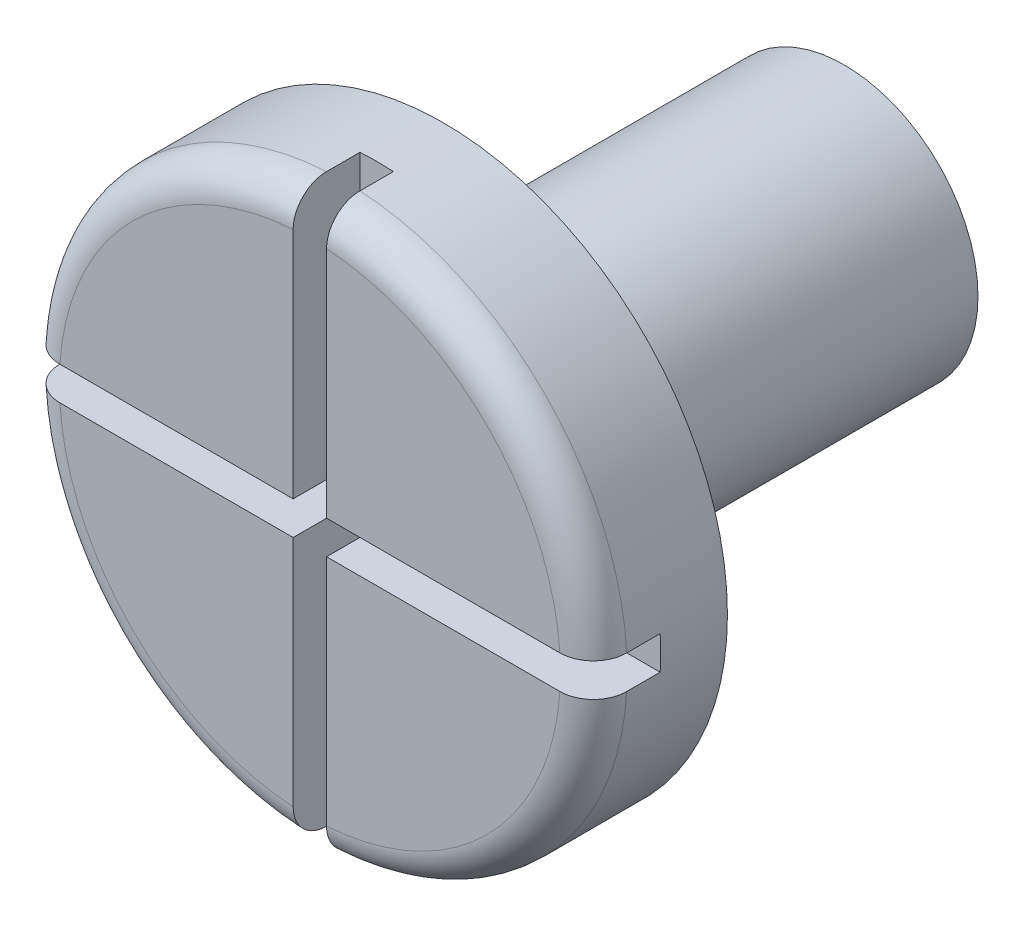
ISO-10303-21;
HEADER;
FILE_DESCRIPTION(('STEP AP214'),'2;1');
FILE_NAME('part.step','',(''),(''),'','','');
FILE_SCHEMA(('AUTOMOTIVE_DESIGN { 1 0 10303 214 1 1 1 1 }'));
ENDSEC;
DATA;
#1=APPLICATION_CONTEXT('core data for automotive mechanical design processes');
#2=APPLICATION_PROTOCOL_DEFINITION('international standard','automotive_design',2000,#1);
#3=PRODUCT_CONTEXT('',#1,'mechanical');
#4=PRODUCT('Part','Part','',(#3));
#5=PRODUCT_RELATED_PRODUCT_CATEGORY('part','',(#4));
#6=PRODUCT_DEFINITION_FORMATION('','',#4);
#7=PRODUCT_DEFINITION_CONTEXT('part definition',#1,'design');
#8=PRODUCT_DEFINITION('design','',#6,#7);
#9=PRODUCT_DEFINITION_SHAPE('','',#8);
#10=(LENGTH_UNIT() NAMED_UNIT(*) SI_UNIT(.MILLI.,.METRE.));
#11=(NAMED_UNIT(*) PLANE_ANGLE_UNIT() SI_UNIT($,.RADIAN.));
#12=(NAMED_UNIT(*) SI_UNIT($,.STERADIAN.) SOLID_ANGLE_UNIT());
#13=UNCERTAINTY_MEASURE_WITH_UNIT(LENGTH_MEASURE(1.E-05),#10,'distance_accuracy_value','');
#14=(GEOMETRIC_REPRESENTATION_CONTEXT(3) GLOBAL_UNCERTAINTY_ASSIGNED_CONTEXT((#13)) GLOBAL_UNIT_ASSIGNED_CONTEXT((#10,
#11,#12)) REPRESENTATION_CONTEXT('',''));
#15=CARTESIAN_POINT('',(0.,0.,0.));
#16=DIRECTION('',(0.,0.,1.));
#17=DIRECTION('',(1.,0.,0.));
#18=AXIS2_PLACEMENT_3D('',#15,#16,#17);
#19=CARTESIAN_POINT('',(0.,0.,0.));
#20=DIRECTION('',(0.,0.,1.));
#21=DIRECTION('',(1.,0.,0.));
#22=AXIS2_PLACEMENT_3D('',#19,#20,#21);
#23=PLANE('',#22);
#24=DIRECTION('',(0.,-1.,0.));
#25=VECTOR('',#24,1.);
#26=CARTESIAN_POINT('',(-0.25,0.,0.));
#27=LINE('',#26,#25);
#28=CARTESIAN_POINT('',(-0.25,3.74165738677394,0.));
#29=VERTEX_POINT('',#28);
#30=CARTESIAN_POINT('',(-0.25,0.25,0.));
#31=VERTEX_POINT('',#30);
#32=EDGE_CURVE('E242',#29,#31,#27,.T.);
#33=ORIENTED_EDGE('',*,*,#32,.F.);
#34=CARTESIAN_POINT('',(0.,0.,0.));
#35=DIRECTION('',(0.,0.,1.));
#36=DIRECTION('',(1.,0.,0.));
#37=AXIS2_PLACEMENT_3D('',#34,#35,#36);
#38=CIRCLE('',#37,3.75);
#39=CARTESIAN_POINT('',(-3.74165738677394,0.25,0.));
#40=VERTEX_POINT('',#39);
#41=EDGE_CURVE('E325',#29,#40,#38,.T.);
#42=ORIENTED_EDGE('',*,*,#41,.T.);
#43=DIRECTION('',(-1.,0.,0.));
#44=VECTOR('',#43,1.);
#45=CARTESIAN_POINT('',(-4.25,0.25,0.));
#46=LINE('',#45,#44);
#47=EDGE_CURVE('E162',#31,#40,#46,.T.);
#48=ORIENTED_EDGE('',*,*,#47,.F.);
#49=EDGE_LOOP('',(#33,#42,#48));
#50=FACE_BOUND('',#49,.T.);
#51=ADVANCED_FACE('F32',(#50),#23,.T.);
#52=DIRECTION('',(-1.,0.,0.));
#53=VECTOR('',#52,1.);
#54=CARTESIAN_POINT('',(0.,0.25,0.));
#55=LINE('',#54,#53);
#56=CARTESIAN_POINT('',(3.74165738677394,0.25,0.));
#57=VERTEX_POINT('',#56);
#58=CARTESIAN_POINT('',(0.25,0.25,0.));
#59=VERTEX_POINT('',#58);
#60=EDGE_CURVE('E240',#57,#59,#55,.T.);
#61=ORIENTED_EDGE('',*,*,#60,.F.);
#62=CARTESIAN_POINT('',(0.,0.,0.));
#63=DIRECTION('',(0.,0.,1.));
#64=DIRECTION('',(1.,0.,0.));
#65=AXIS2_PLACEMENT_3D('',#62,#63,#64);
#66=CIRCLE('',#65,3.75);
#67=CARTESIAN_POINT('',(0.25,3.74165738677394,0.));
#68=VERTEX_POINT('',#67);
#69=EDGE_CURVE('E397',#57,#68,#66,.T.);
#70=ORIENTED_EDGE('',*,*,#69,.T.);
#71=DIRECTION('',(0.,1.,0.));
#72=VECTOR('',#71,1.);
#73=CARTESIAN_POINT('',(0.25,4.25,0.));
#74=LINE('',#73,#72);
#75=EDGE_CURVE('E198',#59,#68,#74,.T.);
#76=ORIENTED_EDGE('',*,*,#75,.F.);
#77=EDGE_LOOP('',(#61,#70,#76));
#78=FACE_BOUND('',#77,.T.);
#79=ADVANCED_FACE('F343',(#78),#23,.T.);
#80=DIRECTION('',(0.,1.,0.));
#81=VECTOR('',#80,1.);
#82=CARTESIAN_POINT('',(0.25,0.,0.));
#83=LINE('',#82,#81);
#84=CARTESIAN_POINT('',(0.25,-3.74165738677394,0.));
#85=VERTEX_POINT('',#84);
#86=CARTESIAN_POINT('',(0.25,-0.25,0.));
#87=VERTEX_POINT('',#86);
#88=EDGE_CURVE('E238',#85,#87,#83,.T.);
#89=ORIENTED_EDGE('',*,*,#88,.F.);
#90=CARTESIAN_POINT('',(0.,0.,0.));
#91=DIRECTION('',(0.,0.,1.));
#92=DIRECTION('',(1.,0.,0.));
#93=AXIS2_PLACEMENT_3D('',#90,#91,#92);
#94=CIRCLE('',#93,3.75);
#95=CARTESIAN_POINT('',(3.74165738677394,-0.25,0.));
#96=VERTEX_POINT('',#95);
#97=EDGE_CURVE('E286',#85,#96,#94,.T.);
#98=ORIENTED_EDGE('',*,*,#97,.T.);
#99=DIRECTION('',(1.,0.,0.));
#100=VECTOR('',#99,1.);
#101=CARTESIAN_POINT('',(0.25,-0.25,0.));
#102=LINE('',#101,#100);
#103=EDGE_CURVE('E195',#87,#96,#102,.T.);
#104=ORIENTED_EDGE('',*,*,#103,.F.);
#105=EDGE_LOOP('',(#89,#98,#104));
#106=FACE_BOUND('',#105,.T.);
#107=ADVANCED_FACE('F350',(#106),#23,.T.);
#108=CARTESIAN_POINT('',(0.,0.,-2.));
#109=DIRECTION('',(0.,0.,1.));
#110=DIRECTION('',(1.,0.,0.));
#111=AXIS2_PLACEMENT_3D('',#108,#109,#110);
#112=PLANE('',#111);
#113=CARTESIAN_POINT('',(0.,0.,-2.));
#114=DIRECTION('',(0.,0.,1.));
#115=DIRECTION('',(1.,0.,0.));
#116=AXIS2_PLACEMENT_3D('',#113,#114,#115);
#117=CIRCLE('',#116,4.25);
#118=CARTESIAN_POINT('',(4.25,0.,-2.));
#119=VERTEX_POINT('',#118);
#120=EDGE_CURVE('E231',#119,#119,#117,.T.);
#121=ORIENTED_EDGE('',*,*,#120,.F.);
#122=EDGE_LOOP('',(#121));
#123=FACE_BOUND('',#122,.T.);
#124=CARTESIAN_POINT('',(0.,0.,-2.));
#125=DIRECTION('',(0.,0.,1.));
#126=DIRECTION('',(1.,0.,0.));
#127=AXIS2_PLACEMENT_3D('',#124,#125,#126);
#128=CIRCLE('',#127,2.);
#129=CARTESIAN_POINT('',(2.,0.,-2.));
#130=VERTEX_POINT('',#129);
#131=EDGE_CURVE('E234',#130,#130,#128,.F.);
#132=ORIENTED_EDGE('',*,*,#131,.F.);
#133=EDGE_LOOP('',(#132));
#134=FACE_BOUND('',#133,.T.);
#135=ADVANCED_FACE('F362',(#123,#134),#112,.F.);
#136=CARTESIAN_POINT('',(0.,0.,-2.));
#137=DIRECTION('',(0.,0.,1.));
#138=DIRECTION('',(1.,0.,0.));
#139=AXIS2_PLACEMENT_3D('',#136,#137,#138);
#140=CYLINDRICAL_SURFACE('',#139,4.25);
#141=DIRECTION('',(0.,0.,1.));
#142=VECTOR('',#141,1.);
#143=CARTESIAN_POINT('',(-0.25,-4.24264068711928,-2.));
#144=LINE('',#143,#142);
#145=CARTESIAN_POINT('',(-0.25,-4.24264068711928,-0.5));
#146=VERTEX_POINT('',#145);
#147=CARTESIAN_POINT('',(-0.25,-4.24264068711928,-1.));
#148=VERTEX_POINT('',#147);
#149=EDGE_CURVE('E177',#146,#148,#144,.F.);
#150=ORIENTED_EDGE('',*,*,#149,.F.);
#151=CARTESIAN_POINT('',(0.,0.,-0.5));
#152=DIRECTION('',(0.,0.,1.));
#153=DIRECTION('',(1.,0.,0.));
#154=AXIS2_PLACEMENT_3D('',#151,#152,#153);
#155=CIRCLE('',#154,4.25);
#156=CARTESIAN_POINT('',(-4.24264068711928,-0.25,-0.5));
#157=VERTEX_POINT('',#156);
#158=EDGE_CURVE('E287',#146,#157,#155,.F.);
#159=ORIENTED_EDGE('',*,*,#158,.T.);
#160=DIRECTION('',(0.,0.,1.));
#161=VECTOR('',#160,1.);
#162=CARTESIAN_POINT('',(-4.24264068711928,-0.25,-2.));
#163=LINE('',#162,#161);
#164=CARTESIAN_POINT('',(-4.24264068711928,-0.25,-1.));
#165=VERTEX_POINT('',#164);
#166=EDGE_CURVE('E206',#165,#157,#163,.T.);
#167=ORIENTED_EDGE('',*,*,#166,.F.);
#168=CARTESIAN_POINT('',(0.,0.,-1.));
#169=DIRECTION('',(0.,0.,1.));
#170=DIRECTION('',(1.,0.,0.));
#171=AXIS2_PLACEMENT_3D('',#168,#169,#170);
#172=CIRCLE('',#171,4.25);
#173=CARTESIAN_POINT('',(-4.24264068711928,0.25,-1.));
#174=VERTEX_POINT('',#173);
#175=EDGE_CURVE('E158',#165,#174,#172,.F.);
#176=ORIENTED_EDGE('',*,*,#175,.T.);
#177=DIRECTION('',(0.,0.,1.));
#178=VECTOR('',#177,1.);
#179=CARTESIAN_POINT('',(-4.24264068711928,0.25,-2.));
#180=LINE('',#179,#178);
#181=CARTESIAN_POINT('',(-4.24264068711928,0.25,-0.5));
#182=VERTEX_POINT('',#181);
#183=EDGE_CURVE('E226',#182,#174,#180,.F.);
#184=ORIENTED_EDGE('',*,*,#183,.F.);
#185=CARTESIAN_POINT('',(0.,0.,-0.5));
#186=DIRECTION('',(0.,0.,1.));
#187=DIRECTION('',(1.,0.,0.));
#188=AXIS2_PLACEMENT_3D('',#185,#186,#187);
#189=CIRCLE('',#188,4.25);
#190=CARTESIAN_POINT('',(-0.25,4.24264068711928,-0.5));
#191=VERTEX_POINT('',#190);
#192=EDGE_CURVE('E260',#182,#191,#189,.F.);
#193=ORIENTED_EDGE('',*,*,#192,.T.);
#194=DIRECTION('',(0.,0.,1.));
#195=VECTOR('',#194,1.);
#196=CARTESIAN_POINT('',(-0.25,4.24264068711928,-2.));
#197=LINE('',#196,#195);
#198=CARTESIAN_POINT('',(-0.25,4.24264068711928,-1.));
#199=VERTEX_POINT('',#198);
#200=EDGE_CURVE('E224',#199,#191,#197,.T.);
#201=ORIENTED_EDGE('',*,*,#200,.F.);
#202=CARTESIAN_POINT('',(0.25,4.24264068711928,-1.));
#203=VERTEX_POINT('',#202);
#204=EDGE_CURVE('E247',#199,#203,#172,.F.);
#205=ORIENTED_EDGE('',*,*,#204,.T.);
#206=DIRECTION('',(0.,0.,1.));
#207=VECTOR('',#206,1.);
#208=CARTESIAN_POINT('',(0.25,4.24264068711928,-2.));
#209=LINE('',#208,#207);
#210=CARTESIAN_POINT('',(0.25,4.24264068711928,-0.5));
#211=VERTEX_POINT('',#210);
#212=EDGE_CURVE('E222',#211,#203,#209,.F.);
#213=ORIENTED_EDGE('',*,*,#212,.F.);
#214=CARTESIAN_POINT('',(0.,0.,-0.5));
#215=DIRECTION('',(0.,0.,1.));
#216=DIRECTION('',(1.,0.,0.));
#217=AXIS2_PLACEMENT_3D('',#214,#215,#216);
#218=CIRCLE('',#217,4.25);
#219=CARTESIAN_POINT('',(4.24264068711928,0.25,-0.5));
#220=VERTEX_POINT('',#219);
#221=EDGE_CURVE('E400',#211,#220,#218,.F.);
#222=ORIENTED_EDGE('',*,*,#221,.T.);
#223=DIRECTION('',(0.,0.,1.));
#224=VECTOR('',#223,1.);
#225=CARTESIAN_POINT('',(4.24264068711928,0.25,-2.));
#226=LINE('',#225,#224);
#227=CARTESIAN_POINT('',(4.24264068711928,0.25,-1.));
#228=VERTEX_POINT('',#227);
#229=EDGE_CURVE('E219',#228,#220,#226,.T.);
#230=ORIENTED_EDGE('',*,*,#229,.F.);
#231=CARTESIAN_POINT('',(4.24264068711928,-0.25,-1.));
#232=VERTEX_POINT('',#231);
#233=EDGE_CURVE('E244',#228,#232,#172,.F.);
#234=ORIENTED_EDGE('',*,*,#233,.T.);
#235=DIRECTION('',(0.,0.,1.));
#236=VECTOR('',#235,1.);
#237=CARTESIAN_POINT('',(4.24264068711928,-0.25,-2.));
#238=LINE('',#237,#236);
#239=CARTESIAN_POINT('',(4.24264068711928,-0.25,-0.5));
#240=VERTEX_POINT('',#239);
#241=EDGE_CURVE('E217',#240,#232,#238,.F.);
#242=ORIENTED_EDGE('',*,*,#241,.F.);
#243=CARTESIAN_POINT('',(0.,0.,-0.5));
#244=DIRECTION('',(0.,0.,1.));
#245=DIRECTION('',(1.,0.,0.));
#246=AXIS2_PLACEMENT_3D('',#243,#244,#245);
#247=CIRCLE('',#246,4.25);
#248=CARTESIAN_POINT('',(0.25,-4.24264068711928,-0.5));
#249=VERTEX_POINT('',#248);
#250=EDGE_CURVE('E377',#240,#249,#247,.F.);
#251=ORIENTED_EDGE('',*,*,#250,.T.);
#252=DIRECTION('',(0.,0.,1.));
#253=VECTOR('',#252,1.);
#254=CARTESIAN_POINT('',(0.25,-4.24264068711928,-2.));
#255=LINE('',#254,#253);
#256=CARTESIAN_POINT('',(0.25,-4.24264068711928,-1.));
#257=VERTEX_POINT('',#256);
#258=EDGE_CURVE('E214',#257,#249,#255,.T.);
#259=ORIENTED_EDGE('',*,*,#258,.F.);
#260=EDGE_CURVE('E248',#257,#148,#172,.F.);
#261=ORIENTED_EDGE('',*,*,#260,.T.);
#262=EDGE_LOOP('',(#150,#159,#167,#176,#184,#193,#201,#205,#213,#222,#230,#234,#242,#251,#259,#261));
#263=FACE_BOUND('',#262,.T.);
#264=ORIENTED_EDGE('',*,*,#120,.T.);
#265=EDGE_LOOP('',(#264));
#266=FACE_BOUND('',#265,.T.);
#267=ADVANCED_FACE('F355',(#263,#266),#140,.T.);
#268=DIRECTION('',(1.,0.,0.));
#269=VECTOR('',#268,1.);
#270=CARTESIAN_POINT('',(0.,-0.25,0.));
#271=LINE('',#270,#269);
#272=CARTESIAN_POINT('',(-3.74165738677394,-0.25,0.));
#273=VERTEX_POINT('',#272);
#274=CARTESIAN_POINT('',(-0.25,-0.25,0.));
#275=VERTEX_POINT('',#274);
#276=EDGE_CURVE('E168',#273,#275,#271,.T.);
#277=ORIENTED_EDGE('',*,*,#276,.F.);
#278=CARTESIAN_POINT('',(0.,0.,0.));
#279=DIRECTION('',(0.,0.,1.));
#280=DIRECTION('',(1.,0.,0.));
#281=AXIS2_PLACEMENT_3D('',#278,#279,#280);
#282=CIRCLE('',#281,3.75);
#283=CARTESIAN_POINT('',(-0.25,-3.74165738677394,0.));
#284=VERTEX_POINT('',#283);
#285=EDGE_CURVE('E249',#273,#284,#282,.T.);
#286=ORIENTED_EDGE('',*,*,#285,.T.);
#287=DIRECTION('',(0.,-1.,0.));
#288=VECTOR('',#287,1.);
#289=CARTESIAN_POINT('',(-0.25,-0.25,0.));
#290=LINE('',#289,#288);
#291=EDGE_CURVE('E193',#275,#284,#290,.T.);
#292=ORIENTED_EDGE('',*,*,#291,.F.);
#293=EDGE_LOOP('',(#277,#286,#292));
#294=FACE_BOUND('',#293,.T.);
#295=ADVANCED_FACE('F346',(#294),#23,.T.);
#296=CARTESIAN_POINT('',(0.,0.,-8.));
#297=DIRECTION('',(0.,0.,1.));
#298=DIRECTION('',(1.,0.,0.));
#299=AXIS2_PLACEMENT_3D('',#296,#297,#298);
#300=CYLINDRICAL_SURFACE('',#299,2.);
#301=CARTESIAN_POINT('',(0.,0.,-8.));
#302=DIRECTION('',(0.,0.,-1.));
#303=DIRECTION('',(-1.,0.,0.));
#304=AXIS2_PLACEMENT_3D('',#301,#302,#303);
#305=CIRCLE('',#304,2.);
#306=CARTESIAN_POINT('',(-2.,0.,-8.));
#307=VERTEX_POINT('',#306);
#308=EDGE_CURVE('E228',#307,#307,#305,.T.);
#309=ORIENTED_EDGE('',*,*,#308,.F.);
#310=EDGE_LOOP('',(#309));
#311=FACE_BOUND('',#310,.T.);
#312=ORIENTED_EDGE('',*,*,#131,.T.);
#313=EDGE_LOOP('',(#312));
#314=FACE_BOUND('',#313,.T.);
#315=ADVANCED_FACE('F354',(#311,#314),#300,.T.);
#316=CARTESIAN_POINT('',(0.,0.,-8.));
#317=DIRECTION('',(0.,0.,-1.));
#318=DIRECTION('',(-1.,0.,0.));
#319=AXIS2_PLACEMENT_3D('',#316,#317,#318);
#320=PLANE('',#319);
#321=ORIENTED_EDGE('',*,*,#308,.T.);
#322=EDGE_LOOP('',(#321));
#323=FACE_BOUND('',#322,.T.);
#324=ADVANCED_FACE('F276',(#323),#320,.T.);
#325=CARTESIAN_POINT('',(-4.25,0.25,-1.));
#326=DIRECTION('',(0.,1.,0.));
#327=DIRECTION('',(-1.,0.,0.));
#328=AXIS2_PLACEMENT_3D('',#325,#326,#327);
#329=PLANE('',#328);
#330=ORIENTED_EDGE('',*,*,#47,.T.);
#331=CARTESIAN_POINT('',(-3.74165738677394,0.25,0.));
#332=CARTESIAN_POINT('',(-3.76988487131675,0.25,2.37581275895512E-05));
#333=CARTESIAN_POINT('',(-3.7981057808099,0.25,-0.00237834240403007));
#334=CARTESIAN_POINT('',(-3.85373055748363,0.25,-0.0118610659259015));
#335=CARTESIAN_POINT('',(-3.88113499340295,0.25,-0.0189383486886156));
#336=CARTESIAN_POINT('',(-3.93437910330614,0.25,-0.037603478062171));
#337=CARTESIAN_POINT('',(-3.9602179678857,0.25,-0.0491936352297728));
#338=CARTESIAN_POINT('',(-4.00957535987559,0.25,-0.0765486768482512));
#339=CARTESIAN_POINT('',(-4.03309434627379,0.25,-0.0923127332101065));
#340=CARTESIAN_POINT('',(-4.07711911810963,0.25,-0.127552510953261));
#341=CARTESIAN_POINT('',(-4.09762840641294,0.25,-0.147023855921699));
#342=CARTESIAN_POINT('',(-4.1350836292076,0.25,-0.189143768385175));
#343=CARTESIAN_POINT('',(-4.1520288745177,0.25,-0.211792948971295));
#344=CARTESIAN_POINT('',(-4.18183859003373,0.25,-0.259578131528812));
#345=CARTESIAN_POINT('',(-4.19470987961174,0.25,-0.28470988439266));
#346=CARTESIAN_POINT('',(-4.21603627335335,0.25,-0.33677469297037));
#347=CARTESIAN_POINT('',(-4.22449407748558,0.25,-0.363706636006281));
#348=CARTESIAN_POINT('',(-4.23461875078727,0.25,-0.40900701110012));
#349=CARTESIAN_POINT('',(-4.23762517794902,0.25,-0.427087323386428));
#350=CARTESIAN_POINT('',(-4.24163584775925,0.25,-0.463442529792267));
#351=CARTESIAN_POINT('',(-4.24264293665713,0.25,-0.481717110011999));
#352=CARTESIAN_POINT('',(-4.24264068711928,0.25,-0.5));
#353=B_SPLINE_CURVE_WITH_KNOTS('',3,(#331,#332,#333,#334,#335,#336,#337,#338,#339,#340,#341,
#342,#343,#344,#345,#346,#347,#348,#349,#350,#351,#352),.UNSPECIFIED.,.F.,.F.,(4,2,2,2,2,2,2,2,
2,2,4),(0.,0.0845710763510946,0.169081795363513,0.253635840225745,0.338173122373846,
0.422611221101345,0.507065632696267,0.591377919589529,0.675638567433488,0.730521522213369,
0.785326289666472),.UNSPECIFIED.);
#354=EDGE_CURVE('E46',#40,#182,#353,.T.);
#355=ORIENTED_EDGE('',*,*,#354,.T.);
#356=ORIENTED_EDGE('',*,*,#183,.T.);
#357=DIRECTION('',(-1.,0.,0.));
#358=VECTOR('',#357,1.);
#359=CARTESIAN_POINT('',(-4.25,0.25,-1.));
#360=LINE('',#359,#358);
#361=CARTESIAN_POINT('',(-0.25,0.25,-1.));
#362=VERTEX_POINT('',#361);
#363=EDGE_CURVE('E173',#362,#174,#360,.T.);
#364=ORIENTED_EDGE('',*,*,#363,.F.);
#365=DIRECTION('',(0.,0.,1.));
#366=VECTOR('',#365,1.);
#367=CARTESIAN_POINT('',(-0.25,0.25,-1.));
#368=LINE('',#367,#366);
#369=EDGE_CURVE('E203',#362,#31,#368,.T.);
#370=ORIENTED_EDGE('',*,*,#369,.T.);
#371=EDGE_LOOP('',(#330,#355,#356,#364,#370));
#372=FACE_BOUND('',#371,.T.);
#373=ADVANCED_FACE('F410',(#372),#329,.F.);
#374=CARTESIAN_POINT('',(-0.25,4.25,-1.));
#375=DIRECTION('',(-1.,0.,0.));
#376=DIRECTION('',(0.,-1.,0.));
#377=AXIS2_PLACEMENT_3D('',#374,#375,#376);
#378=PLANE('',#377);
#379=ORIENTED_EDGE('',*,*,#200,.T.);
#380=CARTESIAN_POINT('',(-0.25,4.24264068711928,-0.5));
#381=CARTESIAN_POINT('',(-0.25,4.24266475964049,-0.47190742284685));
#382=CARTESIAN_POINT('',(-0.25,4.24027045056464,-0.443822241306416));
#383=CARTESIAN_POINT('',(-0.25,4.2308230061548,-0.388469591350765));
#384=CARTESIAN_POINT('',(-0.25,4.22377373984726,-0.36120146349038));
#385=CARTESIAN_POINT('',(-0.25,4.20518945528884,-0.308224294605188));
#386=CARTESIAN_POINT('',(-0.25,4.19365235168293,-0.282515984807171));
#387=CARTESIAN_POINT('',(-0.25,4.16643227406286,-0.233403176199281));
#388=CARTESIAN_POINT('',(-0.25,4.15074997847457,-0.209998301255498));
#389=CARTESIAN_POINT('',(-0.25,4.11567176325906,-0.166133225299076));
#390=CARTESIAN_POINT('',(-0.25,4.09627325168444,-0.145675097103112));
#391=CARTESIAN_POINT('',(-0.25,4.05431770133189,-0.108295373257575));
#392=CARTESIAN_POINT('',(-0.25,4.03176004100095,-0.0913744751843708));
#393=CARTESIAN_POINT('',(-0.25,3.98408823262901,-0.0615215818595292));
#394=CARTESIAN_POINT('',(-0.25,3.95896942295269,-0.0485970392867118));
#395=CARTESIAN_POINT('',(-0.25,3.90692593996653,-0.0271459024384327));
#396=CARTESIAN_POINT('',(-0.25,3.88000227491544,-0.0186168754250726));
#397=CARTESIAN_POINT('',(-0.25,3.8343758433264,-0.00828058171539591));
#398=CARTESIAN_POINT('',(-0.25,3.8159561652508,-0.00517712495263068));
#399=CARTESIAN_POINT('',(-0.25,3.77891263387064,-0.00103708426445182));
#400=CARTESIAN_POINT('',(-0.25,3.7602891092102,2.44098553719136E-06));
#401=CARTESIAN_POINT('',(-0.25,3.74165738677394,0.));
#402=B_SPLINE_CURVE_WITH_KNOTS('',3,(#380,#381,#382,#383,#384,#385,#386,#387,#388,#389,#390,
#391,#392,#393,#394,#395,#396,#397,#398,#399,#400,#401),.UNSPECIFIED.,.F.,.F.,(4,2,2,2,2,2,2,2,
2,2,4),(0.,0.0841652355766755,0.168260604058074,0.252395095746698,0.336515826019238,
0.420695442965265,0.504891645326302,0.589243928546725,0.673549475959189,0.729479448862434,
0.785329658158528),.UNSPECIFIED.);
#403=EDGE_CURVE('E11',#191,#29,#402,.T.);
#404=ORIENTED_EDGE('',*,*,#403,.T.);
#405=ORIENTED_EDGE('',*,*,#32,.T.);
#406=ORIENTED_EDGE('',*,*,#369,.F.);
#407=DIRECTION('',(0.,-1.,0.));
#408=VECTOR('',#407,1.);
#409=CARTESIAN_POINT('',(-0.25,4.25,-1.));
#410=LINE('',#409,#408);
#411=EDGE_CURVE('E190',#199,#362,#410,.T.);
#412=ORIENTED_EDGE('',*,*,#411,.F.);
#413=EDGE_LOOP('',(#379,#404,#405,#406,#412));
#414=FACE_BOUND('',#413,.T.);
#415=ADVANCED_FACE('F401',(#414),#378,.F.);
#416=CARTESIAN_POINT('',(0.25,4.25,-1.));
#417=DIRECTION('',(1.,0.,0.));
#418=DIRECTION('',(0.,0.,-1.));
#419=AXIS2_PLACEMENT_3D('',#416,#417,#418);
#420=PLANE('',#419);
#421=ORIENTED_EDGE('',*,*,#75,.T.);
#422=CARTESIAN_POINT('',(0.25,3.74165738677394,0.));
#423=CARTESIAN_POINT('',(0.25,3.76988487131675,2.37581275895512E-05));
#424=CARTESIAN_POINT('',(0.25,3.7981057808099,-0.00237834240403007));
#425=CARTESIAN_POINT('',(0.25,3.85373055748363,-0.0118610659259015));
#426=CARTESIAN_POINT('',(0.25,3.88113499340295,-0.0189383486886156));
#427=CARTESIAN_POINT('',(0.25,3.93437910330614,-0.037603478062171));
#428=CARTESIAN_POINT('',(0.25,3.9602179678857,-0.0491936352297728));
#429=CARTESIAN_POINT('',(0.25,4.00957535987559,-0.0765486768482512));
#430=CARTESIAN_POINT('',(0.25,4.03309434627379,-0.0923127332101065));
#431=CARTESIAN_POINT('',(0.25,4.07711911810963,-0.127552510953261));
#432=CARTESIAN_POINT('',(0.25,4.09762840641294,-0.147023855921699));
#433=CARTESIAN_POINT('',(0.25,4.1350836292076,-0.189143768385175));
#434=CARTESIAN_POINT('',(0.25,4.1520288745177,-0.211792948971295));
#435=CARTESIAN_POINT('',(0.25,4.18183859003373,-0.259578131528812));
#436=CARTESIAN_POINT('',(0.25,4.19470987961174,-0.28470988439266));
#437=CARTESIAN_POINT('',(0.25,4.21603627335335,-0.33677469297037));
#438=CARTESIAN_POINT('',(0.25,4.22449407748558,-0.363706636006281));
#439=CARTESIAN_POINT('',(0.25,4.23461875078727,-0.40900701110012));
#440=CARTESIAN_POINT('',(0.25,4.23762517794902,-0.427087323386428));
#441=CARTESIAN_POINT('',(0.25,4.24163584775925,-0.463442529792267));
#442=CARTESIAN_POINT('',(0.25,4.24264293665713,-0.481717110011999));
#443=CARTESIAN_POINT('',(0.25,4.24264068711928,-0.5));
#444=B_SPLINE_CURVE_WITH_KNOTS('',3,(#422,#423,#424,#425,#426,#427,#428,#429,#430,#431,#432,
#433,#434,#435,#436,#437,#438,#439,#440,#441,#442,#443),.UNSPECIFIED.,.F.,.F.,(4,2,2,2,2,2,2,2,
2,2,4),(0.,0.0845710763510946,0.169081795363513,0.253635840225745,0.338173122373846,
0.422611221101345,0.507065632696267,0.591377919589529,0.675638567433488,0.730521522213369,
0.785326289666472),.UNSPECIFIED.);
#445=EDGE_CURVE('E326',#68,#211,#444,.T.);
#446=ORIENTED_EDGE('',*,*,#445,.T.);
#447=ORIENTED_EDGE('',*,*,#212,.T.);
#448=DIRECTION('',(0.,1.,0.));
#449=VECTOR('',#448,1.);
#450=CARTESIAN_POINT('',(0.25,4.25,-1.));
#451=LINE('',#450,#449);
#452=CARTESIAN_POINT('',(0.25,0.25,-1.));
#453=VERTEX_POINT('',#452);
#454=EDGE_CURVE('E187',#453,#203,#451,.T.);
#455=ORIENTED_EDGE('',*,*,#454,.F.);
#456=DIRECTION('',(0.,0.,1.));
#457=VECTOR('',#456,1.);
#458=CARTESIAN_POINT('',(0.25,0.25,-1.));
#459=LINE('',#458,#457);
#460=EDGE_CURVE('E207',#453,#59,#459,.T.);
#461=ORIENTED_EDGE('',*,*,#460,.T.);
#462=EDGE_LOOP('',(#421,#446,#447,#455,#461));
#463=FACE_BOUND('',#462,.T.);
#464=ADVANCED_FACE('F314',(#463),#420,.F.);
#465=CARTESIAN_POINT('',(0.25,0.25,-1.));
#466=DIRECTION('',(0.,1.,0.));
#467=DIRECTION('',(-1.,0.,0.));
#468=AXIS2_PLACEMENT_3D('',#465,#466,#467);
#469=PLANE('',#468);
#470=ORIENTED_EDGE('',*,*,#229,.T.);
#471=CARTESIAN_POINT('',(4.24264068711928,0.25,-0.5));
#472=CARTESIAN_POINT('',(4.24266475964049,0.25,-0.47190742284685));
#473=CARTESIAN_POINT('',(4.24027045056464,0.25,-0.443822241306416));
#474=CARTESIAN_POINT('',(4.2308230061548,0.25,-0.388469591350765));
#475=CARTESIAN_POINT('',(4.22377373984726,0.25,-0.36120146349038));
#476=CARTESIAN_POINT('',(4.20518945528884,0.25,-0.308224294605188));
#477=CARTESIAN_POINT('',(4.19365235168293,0.25,-0.282515984807171));
#478=CARTESIAN_POINT('',(4.16643227406286,0.25,-0.233403176199281));
#479=CARTESIAN_POINT('',(4.15074997847457,0.25,-0.209998301255498));
#480=CARTESIAN_POINT('',(4.11567176325906,0.25,-0.166133225299076));
#481=CARTESIAN_POINT('',(4.09627325168444,0.25,-0.145675097103112));
#482=CARTESIAN_POINT('',(4.05431770133189,0.25,-0.108295373257575));
#483=CARTESIAN_POINT('',(4.03176004100095,0.25,-0.0913744751843708));
#484=CARTESIAN_POINT('',(3.98408823262901,0.25,-0.0615215818595292));
#485=CARTESIAN_POINT('',(3.95896942295269,0.25,-0.0485970392867118));
#486=CARTESIAN_POINT('',(3.90692593996653,0.25,-0.0271459024384327));
#487=CARTESIAN_POINT('',(3.88000227491544,0.25,-0.0186168754250726));
#488=CARTESIAN_POINT('',(3.8343758433264,0.25,-0.00828058171539591));
#489=CARTESIAN_POINT('',(3.8159561652508,0.25,-0.00517712495263068));
#490=CARTESIAN_POINT('',(3.77891263387064,0.25,-0.00103708426445182));
#491=CARTESIAN_POINT('',(3.7602891092102,0.25,2.44098553719136E-06));
#492=CARTESIAN_POINT('',(3.74165738677394,0.25,0.));
#493=B_SPLINE_CURVE_WITH_KNOTS('',3,(#471,#472,#473,#474,#475,#476,#477,#478,#479,#480,#481,
#482,#483,#484,#485,#486,#487,#488,#489,#490,#491,#492),.UNSPECIFIED.,.F.,.F.,(4,2,2,2,2,2,2,2,
2,2,4),(0.,0.0841652355766755,0.168260604058074,0.252395095746698,0.336515826019238,
0.420695442965265,0.504891645326302,0.589243928546725,0.673549475959189,0.729479448862434,
0.785329658158528),.UNSPECIFIED.);
#494=EDGE_CURVE('E318',#220,#57,#493,.T.);
#495=ORIENTED_EDGE('',*,*,#494,.T.);
#496=ORIENTED_EDGE('',*,*,#60,.T.);
#497=ORIENTED_EDGE('',*,*,#460,.F.);
#498=DIRECTION('',(-1.,0.,0.));
#499=VECTOR('',#498,1.);
#500=CARTESIAN_POINT('',(0.25,0.25,-1.));
#501=LINE('',#500,#499);
#502=EDGE_CURVE('E185',#228,#453,#501,.T.);
#503=ORIENTED_EDGE('',*,*,#502,.F.);
#504=EDGE_LOOP('',(#470,#495,#496,#497,#503));
#505=FACE_BOUND('',#504,.T.);
#506=ADVANCED_FACE('F309',(#505),#469,.F.);
#507=CARTESIAN_POINT('',(0.25,-0.25,-1.));
#508=DIRECTION('',(0.,-1.,0.));
#509=DIRECTION('',(1.,0.,0.));
#510=AXIS2_PLACEMENT_3D('',#507,#508,#509);
#511=PLANE('',#510);
#512=ORIENTED_EDGE('',*,*,#103,.T.);
#513=CARTESIAN_POINT('',(3.74165738677394,-0.25,0.));
#514=CARTESIAN_POINT('',(3.76988487131675,-0.25,2.37581275895512E-05));
#515=CARTESIAN_POINT('',(3.7981057808099,-0.25,-0.00237834240403007));
#516=CARTESIAN_POINT('',(3.85373055748363,-0.25,-0.0118610659259015));
#517=CARTESIAN_POINT('',(3.88113499340295,-0.25,-0.0189383486886156));
#518=CARTESIAN_POINT('',(3.93437910330614,-0.25,-0.037603478062171));
#519=CARTESIAN_POINT('',(3.9602179678857,-0.25,-0.0491936352297728));
#520=CARTESIAN_POINT('',(4.00957535987559,-0.25,-0.0765486768482512));
#521=CARTESIAN_POINT('',(4.03309434627379,-0.25,-0.0923127332101065));
#522=CARTESIAN_POINT('',(4.07711911810963,-0.25,-0.127552510953261));
#523=CARTESIAN_POINT('',(4.09762840641294,-0.25,-0.147023855921699));
#524=CARTESIAN_POINT('',(4.1350836292076,-0.25,-0.189143768385175));
#525=CARTESIAN_POINT('',(4.1520288745177,-0.25,-0.211792948971295));
#526=CARTESIAN_POINT('',(4.18183859003373,-0.25,-0.259578131528812));
#527=CARTESIAN_POINT('',(4.19470987961174,-0.25,-0.28470988439266));
#528=CARTESIAN_POINT('',(4.21603627335335,-0.25,-0.33677469297037));
#529=CARTESIAN_POINT('',(4.22449407748558,-0.25,-0.363706636006281));
#530=CARTESIAN_POINT('',(4.23461875078727,-0.25,-0.40900701110012));
#531=CARTESIAN_POINT('',(4.23762517794902,-0.25,-0.427087323386428));
#532=CARTESIAN_POINT('',(4.24163584775925,-0.25,-0.463442529792267));
#533=CARTESIAN_POINT('',(4.24264293665713,-0.25,-0.481717110011999));
#534=CARTESIAN_POINT('',(4.24264068711928,-0.25,-0.5));
#535=B_SPLINE_CURVE_WITH_KNOTS('',3,(#513,#514,#515,#516,#517,#518,#519,#520,#521,#522,#523,
#524,#525,#526,#527,#528,#529,#530,#531,#532,#533,#534),.UNSPECIFIED.,.F.,.F.,(4,2,2,2,2,2,2,2,
2,2,4),(0.,0.0845710763510946,0.169081795363513,0.253635840225745,0.338173122373846,
0.422611221101345,0.507065632696267,0.591377919589529,0.675638567433488,0.730521522213369,
0.785326289666472),.UNSPECIFIED.);
#536=EDGE_CURVE('E291',#96,#240,#535,.T.);
#537=ORIENTED_EDGE('',*,*,#536,.T.);
#538=ORIENTED_EDGE('',*,*,#241,.T.);
#539=DIRECTION('',(1.,0.,0.));
#540=VECTOR('',#539,1.);
#541=CARTESIAN_POINT('',(0.25,-0.25,-1.));
#542=LINE('',#541,#540);
#543=CARTESIAN_POINT('',(0.25,-0.25,-1.));
#544=VERTEX_POINT('',#543);
#545=EDGE_CURVE('E180',#544,#232,#542,.T.);
#546=ORIENTED_EDGE('',*,*,#545,.F.);
#547=DIRECTION('',(0.,0.,1.));
#548=VECTOR('',#547,1.);
#549=CARTESIAN_POINT('',(0.25,-0.25,-1.));
#550=LINE('',#549,#548);
#551=EDGE_CURVE('E172',#544,#87,#550,.T.);
#552=ORIENTED_EDGE('',*,*,#551,.T.);
#553=EDGE_LOOP('',(#512,#537,#538,#546,#552));
#554=FACE_BOUND('',#553,.T.);
#555=ADVANCED_FACE('F305',(#554),#511,.F.);
#556=CARTESIAN_POINT('',(0.25,-0.25,-1.));
#557=DIRECTION('',(1.,0.,0.));
#558=DIRECTION('',(0.,1.,0.));
#559=AXIS2_PLACEMENT_3D('',#556,#557,#558);
#560=PLANE('',#559);
#561=ORIENTED_EDGE('',*,*,#258,.T.);
#562=CARTESIAN_POINT('',(0.25,-4.24264068711928,-0.5));
#563=CARTESIAN_POINT('',(0.25,-4.24266475964049,-0.47190742284685));
#564=CARTESIAN_POINT('',(0.25,-4.24027045056464,-0.443822241306416));
#565=CARTESIAN_POINT('',(0.25,-4.2308230061548,-0.388469591350765));
#566=CARTESIAN_POINT('',(0.25,-4.22377373984726,-0.36120146349038));
#567=CARTESIAN_POINT('',(0.25,-4.20518945528884,-0.308224294605188));
#568=CARTESIAN_POINT('',(0.25,-4.19365235168293,-0.282515984807171));
#569=CARTESIAN_POINT('',(0.25,-4.16643227406286,-0.233403176199281));
#570=CARTESIAN_POINT('',(0.25,-4.15074997847457,-0.209998301255498));
#571=CARTESIAN_POINT('',(0.25,-4.11567176325906,-0.166133225299076));
#572=CARTESIAN_POINT('',(0.25,-4.09627325168444,-0.145675097103112));
#573=CARTESIAN_POINT('',(0.25,-4.05431770133189,-0.108295373257575));
#574=CARTESIAN_POINT('',(0.25,-4.03176004100095,-0.0913744751843708));
#575=CARTESIAN_POINT('',(0.25,-3.98408823262901,-0.0615215818595292));
#576=CARTESIAN_POINT('',(0.25,-3.95896942295269,-0.0485970392867118));
#577=CARTESIAN_POINT('',(0.25,-3.90692593996653,-0.0271459024384327));
#578=CARTESIAN_POINT('',(0.25,-3.88000227491544,-0.0186168754250726));
#579=CARTESIAN_POINT('',(0.25,-3.8343758433264,-0.00828058171539591));
#580=CARTESIAN_POINT('',(0.25,-3.8159561652508,-0.00517712495263068));
#581=CARTESIAN_POINT('',(0.25,-3.77891263387064,-0.00103708426445182));
#582=CARTESIAN_POINT('',(0.25,-3.7602891092102,2.44098553719136E-06));
#583=CARTESIAN_POINT('',(0.25,-3.74165738677394,0.));
#584=B_SPLINE_CURVE_WITH_KNOTS('',3,(#562,#563,#564,#565,#566,#567,#568,#569,#570,#571,#572,
#573,#574,#575,#576,#577,#578,#579,#580,#581,#582,#583),.UNSPECIFIED.,.F.,.F.,(4,2,2,2,2,2,2,2,
2,2,4),(0.,0.0841652355766755,0.168260604058074,0.252395095746698,0.336515826019238,
0.420695442965265,0.504891645326302,0.589243928546725,0.673549475959189,0.729479448862434,
0.785329658158528),.UNSPECIFIED.);
#585=EDGE_CURVE('E297',#249,#85,#584,.T.);
#586=ORIENTED_EDGE('',*,*,#585,.T.);
#587=ORIENTED_EDGE('',*,*,#88,.T.);
#588=ORIENTED_EDGE('',*,*,#551,.F.);
#589=DIRECTION('',(0.,1.,0.));
#590=VECTOR('',#589,1.);
#591=CARTESIAN_POINT('',(0.25,-0.25,-1.));
#592=LINE('',#591,#590);
#593=EDGE_CURVE('E178',#257,#544,#592,.T.);
#594=ORIENTED_EDGE('',*,*,#593,.F.);
#595=EDGE_LOOP('',(#561,#586,#587,#588,#594));
#596=FACE_BOUND('',#595,.T.);
#597=ADVANCED_FACE('F270',(#596),#560,.F.);
#598=CARTESIAN_POINT('',(-0.25,-0.25,-1.));
#599=DIRECTION('',(-1.,0.,0.));
#600=DIRECTION('',(0.,-1.,0.));
#601=AXIS2_PLACEMENT_3D('',#598,#599,#600);
#602=PLANE('',#601);
#603=ORIENTED_EDGE('',*,*,#291,.T.);
#604=CARTESIAN_POINT('',(-0.25,-3.74165738677394,0.));
#605=CARTESIAN_POINT('',(-0.25,-3.76988487131675,2.37581275895512E-05));
#606=CARTESIAN_POINT('',(-0.25,-3.7981057808099,-0.00237834240403007));
#607=CARTESIAN_POINT('',(-0.25,-3.85373055748363,-0.0118610659259015));
#608=CARTESIAN_POINT('',(-0.25,-3.88113499340295,-0.0189383486886156));
#609=CARTESIAN_POINT('',(-0.25,-3.93437910330614,-0.037603478062171));
#610=CARTESIAN_POINT('',(-0.25,-3.9602179678857,-0.0491936352297728));
#611=CARTESIAN_POINT('',(-0.25,-4.00957535987559,-0.0765486768482512));
#612=CARTESIAN_POINT('',(-0.25,-4.03309434627379,-0.0923127332101065));
#613=CARTESIAN_POINT('',(-0.25,-4.07711911810963,-0.127552510953261));
#614=CARTESIAN_POINT('',(-0.25,-4.09762840641294,-0.147023855921699));
#615=CARTESIAN_POINT('',(-0.25,-4.1350836292076,-0.189143768385175));
#616=CARTESIAN_POINT('',(-0.25,-4.1520288745177,-0.211792948971295));
#617=CARTESIAN_POINT('',(-0.25,-4.18183859003373,-0.259578131528812));
#618=CARTESIAN_POINT('',(-0.25,-4.19470987961174,-0.28470988439266));
#619=CARTESIAN_POINT('',(-0.25,-4.21603627335335,-0.33677469297037));
#620=CARTESIAN_POINT('',(-0.25,-4.22449407748558,-0.363706636006281));
#621=CARTESIAN_POINT('',(-0.25,-4.23461875078727,-0.40900701110012));
#622=CARTESIAN_POINT('',(-0.25,-4.23762517794902,-0.427087323386428));
#623=CARTESIAN_POINT('',(-0.25,-4.24163584775925,-0.463442529792267));
#624=CARTESIAN_POINT('',(-0.25,-4.24264293665713,-0.481717110011999));
#625=CARTESIAN_POINT('',(-0.25,-4.24264068711928,-0.5));
#626=B_SPLINE_CURVE_WITH_KNOTS('',3,(#604,#605,#606,#607,#608,#609,#610,#611,#612,#613,#614,
#615,#616,#617,#618,#619,#620,#621,#622,#623,#624,#625),.UNSPECIFIED.,.F.,.F.,(4,2,2,2,2,2,2,2,
2,2,4),(0.,0.0845710763510946,0.169081795363513,0.253635840225745,0.338173122373846,
0.422611221101345,0.507065632696267,0.591377919589529,0.675638567433488,0.730521522213369,
0.785326289666472),.UNSPECIFIED.);
#627=EDGE_CURVE('E252',#284,#146,#626,.T.);
#628=ORIENTED_EDGE('',*,*,#627,.T.);
#629=ORIENTED_EDGE('',*,*,#149,.T.);
#630=DIRECTION('',(0.,-1.,0.));
#631=VECTOR('',#630,1.);
#632=CARTESIAN_POINT('',(-0.25,-0.25,-1.));
#633=LINE('',#632,#631);
#634=CARTESIAN_POINT('',(-0.25,-0.25,-1.));
#635=VERTEX_POINT('',#634);
#636=EDGE_CURVE('E154',#635,#148,#633,.T.);
#637=ORIENTED_EDGE('',*,*,#636,.F.);
#638=DIRECTION('',(0.,0.,1.));
#639=VECTOR('',#638,1.);
#640=CARTESIAN_POINT('',(-0.25,-0.25,-1.));
#641=LINE('',#640,#639);
#642=EDGE_CURVE('E165',#635,#275,#641,.T.);
#643=ORIENTED_EDGE('',*,*,#642,.T.);
#644=EDGE_LOOP('',(#603,#628,#629,#637,#643));
#645=FACE_BOUND('',#644,.T.);
#646=ADVANCED_FACE('F175',(#645),#602,.F.);
#647=CARTESIAN_POINT('',(-4.25,-0.25,-1.));
#648=DIRECTION('',(0.,-1.,0.));
#649=DIRECTION('',(0.,0.,-1.));
#650=AXIS2_PLACEMENT_3D('',#647,#648,#649);
#651=PLANE('',#650);
#652=ORIENTED_EDGE('',*,*,#166,.T.);
#653=CARTESIAN_POINT('',(-4.24264068711928,-0.25,-0.5));
#654=CARTESIAN_POINT('',(-4.24266475964049,-0.25,-0.47190742284685));
#655=CARTESIAN_POINT('',(-4.24027045056464,-0.25,-0.443822241306416));
#656=CARTESIAN_POINT('',(-4.2308230061548,-0.25,-0.388469591350765));
#657=CARTESIAN_POINT('',(-4.22377373984726,-0.25,-0.36120146349038));
#658=CARTESIAN_POINT('',(-4.20518945528884,-0.25,-0.308224294605188));
#659=CARTESIAN_POINT('',(-4.19365235168293,-0.25,-0.282515984807171));
#660=CARTESIAN_POINT('',(-4.16643227406286,-0.25,-0.233403176199281));
#661=CARTESIAN_POINT('',(-4.15074997847457,-0.25,-0.209998301255498));
#662=CARTESIAN_POINT('',(-4.11567176325906,-0.25,-0.166133225299076));
#663=CARTESIAN_POINT('',(-4.09627325168444,-0.25,-0.145675097103112));
#664=CARTESIAN_POINT('',(-4.05431770133189,-0.25,-0.108295373257575));
#665=CARTESIAN_POINT('',(-4.03176004100095,-0.25,-0.0913744751843708));
#666=CARTESIAN_POINT('',(-3.98408823262901,-0.25,-0.0615215818595292));
#667=CARTESIAN_POINT('',(-3.95896942295269,-0.25,-0.0485970392867118));
#668=CARTESIAN_POINT('',(-3.90692593996653,-0.25,-0.0271459024384327));
#669=CARTESIAN_POINT('',(-3.88000227491544,-0.25,-0.0186168754250726));
#670=CARTESIAN_POINT('',(-3.8343758433264,-0.25,-0.00828058171539591));
#671=CARTESIAN_POINT('',(-3.8159561652508,-0.25,-0.00517712495263068));
#672=CARTESIAN_POINT('',(-3.77891263387064,-0.25,-0.00103708426445182));
#673=CARTESIAN_POINT('',(-3.7602891092102,-0.25,2.44098553719136E-06));
#674=CARTESIAN_POINT('',(-3.74165738677394,-0.25,0.));
#675=B_SPLINE_CURVE_WITH_KNOTS('',3,(#653,#654,#655,#656,#657,#658,#659,#660,#661,#662,#663,
#664,#665,#666,#667,#668,#669,#670,#671,#672,#673,#674),.UNSPECIFIED.,.F.,.F.,(4,2,2,2,2,2,2,2,
2,2,4),(0.,0.0841652355766755,0.168260604058074,0.252395095746698,0.336515826019238,
0.420695442965265,0.504891645326302,0.589243928546725,0.673549475959189,0.729479448862434,
0.785329658158528),.UNSPECIFIED.);
#676=EDGE_CURVE('E279',#157,#273,#675,.T.);
#677=ORIENTED_EDGE('',*,*,#676,.T.);
#678=ORIENTED_EDGE('',*,*,#276,.T.);
#679=ORIENTED_EDGE('',*,*,#642,.F.);
#680=DIRECTION('',(1.,0.,0.));
#681=VECTOR('',#680,1.);
#682=CARTESIAN_POINT('',(-4.25,-0.25,-1.));
#683=LINE('',#682,#681);
#684=EDGE_CURVE('E150',#165,#635,#683,.T.);
#685=ORIENTED_EDGE('',*,*,#684,.F.);
#686=EDGE_LOOP('',(#652,#677,#678,#679,#685));
#687=FACE_BOUND('',#686,.T.);
#688=ADVANCED_FACE('F166',(#687),#651,.F.);
#689=CARTESIAN_POINT('',(0.806302589842992,-1.72218153688313,-1.));
#690=DIRECTION('',(0.,0.,1.));
#691=DIRECTION('',(1.,0.,0.));
#692=AXIS2_PLACEMENT_3D('',#689,#690,#691);
#693=PLANE('',#692);
#694=ORIENTED_EDGE('',*,*,#593,.T.);
#695=ORIENTED_EDGE('',*,*,#545,.T.);
#696=ORIENTED_EDGE('',*,*,#233,.F.);
#697=ORIENTED_EDGE('',*,*,#502,.T.);
#698=ORIENTED_EDGE('',*,*,#454,.T.);
#699=ORIENTED_EDGE('',*,*,#204,.F.);
#700=ORIENTED_EDGE('',*,*,#411,.T.);
#701=ORIENTED_EDGE('',*,*,#363,.T.);
#702=ORIENTED_EDGE('',*,*,#175,.F.);
#703=ORIENTED_EDGE('',*,*,#684,.T.);
#704=ORIENTED_EDGE('',*,*,#636,.T.);
#705=ORIENTED_EDGE('',*,*,#260,.F.);
#706=EDGE_LOOP('',(#694,#695,#696,#697,#698,#699,#700,#701,#702,#703,#704,#705));
#707=FACE_BOUND('',#706,.T.);
#708=ADVANCED_FACE('F152',(#707),#693,.T.);
#709=CARTESIAN_POINT('',(0.,0.,-0.5));
#710=DIRECTION('',(0.,0.,1.));
#711=DIRECTION('',(1.,0.,0.));
#712=AXIS2_PLACEMENT_3D('',#709,#710,#711);
#713=TOROIDAL_SURFACE('',#712,3.75,0.5);
#714=ORIENTED_EDGE('',*,*,#676,.F.);
#715=ORIENTED_EDGE('',*,*,#158,.F.);
#716=ORIENTED_EDGE('',*,*,#627,.F.);
#717=ORIENTED_EDGE('',*,*,#285,.F.);
#718=EDGE_LOOP('',(#714,#715,#716,#717));
#719=FACE_BOUND('',#718,.T.);
#720=ADVANCED_FACE('F262',(#719),#713,.T.);
#721=CARTESIAN_POINT('',(0.,0.,-0.5));
#722=DIRECTION('',(0.,0.,1.));
#723=DIRECTION('',(1.,0.,0.));
#724=AXIS2_PLACEMENT_3D('',#721,#722,#723);
#725=TOROIDAL_SURFACE('',#724,3.75,0.5);
#726=ORIENTED_EDGE('',*,*,#585,.F.);
#727=ORIENTED_EDGE('',*,*,#250,.F.);
#728=ORIENTED_EDGE('',*,*,#536,.F.);
#729=ORIENTED_EDGE('',*,*,#97,.F.);
#730=EDGE_LOOP('',(#726,#727,#728,#729));
#731=FACE_BOUND('',#730,.T.);
#732=ADVANCED_FACE('F303',(#731),#725,.T.);
#733=CARTESIAN_POINT('',(0.,0.,-0.5));
#734=DIRECTION('',(0.,0.,1.));
#735=DIRECTION('',(1.,0.,0.));
#736=AXIS2_PLACEMENT_3D('',#733,#734,#735);
#737=TOROIDAL_SURFACE('',#736,3.75,0.5);
#738=ORIENTED_EDGE('',*,*,#494,.F.);
#739=ORIENTED_EDGE('',*,*,#221,.F.);
#740=ORIENTED_EDGE('',*,*,#445,.F.);
#741=ORIENTED_EDGE('',*,*,#69,.F.);
#742=EDGE_LOOP('',(#738,#739,#740,#741));
#743=FACE_BOUND('',#742,.T.);
#744=ADVANCED_FACE('F331',(#743),#737,.T.);
#745=CARTESIAN_POINT('',(0.,0.,-0.5));
#746=DIRECTION('',(0.,0.,1.));
#747=DIRECTION('',(1.,0.,0.));
#748=AXIS2_PLACEMENT_3D('',#745,#746,#747);
#749=TOROIDAL_SURFACE('',#748,3.75,0.5);
#750=ORIENTED_EDGE('',*,*,#403,.F.);
#751=ORIENTED_EDGE('',*,*,#192,.F.);
#752=ORIENTED_EDGE('',*,*,#354,.F.);
#753=ORIENTED_EDGE('',*,*,#41,.F.);
#754=EDGE_LOOP('',(#750,#751,#752,#753));
#755=FACE_BOUND('',#754,.T.);
#756=ADVANCED_FACE('F34',(#755),#749,.T.);
#757=CLOSED_SHELL('',(#51,#79,#107,#135,#267,#295,#315,#324,#373,#415,#464,#506,#555,#597,#646,
#688,#708,#720,#732,#744,#756));
#758=MANIFOLD_SOLID_BREP('B2',#757);
#759=ADVANCED_BREP_SHAPE_REPRESENTATION('',(#18,#758),#14);
#760=SHAPE_DEFINITION_REPRESENTATION(#9,#759);
ENDSEC;
END-ISO-10303-21;
